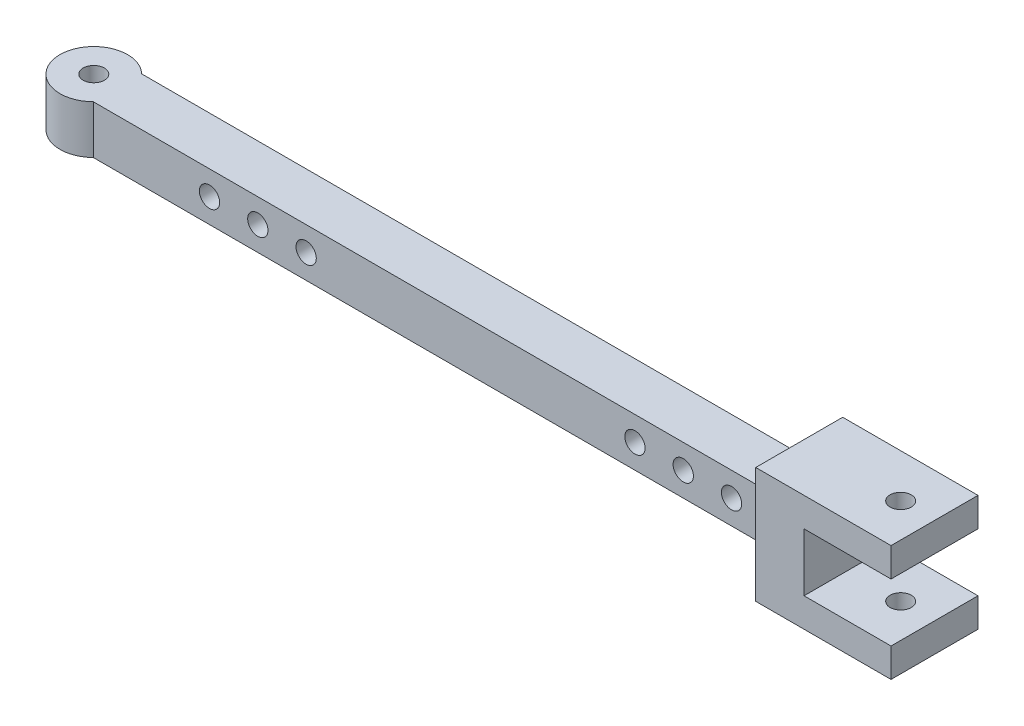
ISO-10303-21;
HEADER;
FILE_DESCRIPTION(('STEP AP214'),'2;1');
FILE_NAME('part.step','',(''),(''),'','','');
FILE_SCHEMA(('AUTOMOTIVE_DESIGN { 1 0 10303 214 1 1 1 1 }'));
ENDSEC;
DATA;
#1=APPLICATION_CONTEXT('core data for automotive mechanical design processes');
#2=APPLICATION_PROTOCOL_DEFINITION('international standard','automotive_design',2000,#1);
#3=PRODUCT_CONTEXT('',#1,'mechanical');
#4=PRODUCT('Part','Part','',(#3));
#5=PRODUCT_RELATED_PRODUCT_CATEGORY('part','',(#4));
#6=PRODUCT_DEFINITION_FORMATION('','',#4);
#7=PRODUCT_DEFINITION_CONTEXT('part definition',#1,'design');
#8=PRODUCT_DEFINITION('design','',#6,#7);
#9=PRODUCT_DEFINITION_SHAPE('','',#8);
#10=(LENGTH_UNIT() NAMED_UNIT(*) SI_UNIT(.MILLI.,.METRE.));
#11=(NAMED_UNIT(*) PLANE_ANGLE_UNIT() SI_UNIT($,.RADIAN.));
#12=(NAMED_UNIT(*) SI_UNIT($,.STERADIAN.) SOLID_ANGLE_UNIT());
#13=UNCERTAINTY_MEASURE_WITH_UNIT(LENGTH_MEASURE(1.E-05),#10,'distance_accuracy_value','');
#14=(GEOMETRIC_REPRESENTATION_CONTEXT(3) GLOBAL_UNCERTAINTY_ASSIGNED_CONTEXT((#13)) GLOBAL_UNIT_ASSIGNED_CONTEXT((#10,
#11,#12)) REPRESENTATION_CONTEXT('',''));
#15=CARTESIAN_POINT('',(0.,0.,0.));
#16=DIRECTION('',(0.,0.,1.));
#17=DIRECTION('',(1.,0.,0.));
#18=AXIS2_PLACEMENT_3D('',#15,#16,#17);
#19=CARTESIAN_POINT('',(47.,-3.5,-4.5));
#20=DIRECTION('',(1.,0.,0.));
#21=DIRECTION('',(0.,0.,-1.));
#22=AXIS2_PLACEMENT_3D('',#19,#20,#21);
#23=PLANE('',#22);
#24=DIRECTION('',(0.,1.,0.));
#25=VECTOR('',#24,1.);
#26=CARTESIAN_POINT('',(47.,-3.5,4.5));
#27=LINE('',#26,#25);
#28=CARTESIAN_POINT('',(47.,5.5,4.5));
#29=VERTEX_POINT('',#28);
#30=CARTESIAN_POINT('',(47.,8.5,4.5));
#31=VERTEX_POINT('',#30);
#32=EDGE_CURVE('E167',#29,#31,#27,.T.);
#33=ORIENTED_EDGE('',*,*,#32,.F.);
#34=DIRECTION('',(0.,0.,-1.));
#35=VECTOR('',#34,1.);
#36=CARTESIAN_POINT('',(47.,5.5,-4.5));
#37=LINE('',#36,#35);
#38=CARTESIAN_POINT('',(47.,5.5,-4.5));
#39=VERTEX_POINT('',#38);
#40=EDGE_CURVE('E208',#29,#39,#37,.T.);
#41=ORIENTED_EDGE('',*,*,#40,.T.);
#42=DIRECTION('',(0.,1.,0.));
#43=VECTOR('',#42,1.);
#44=CARTESIAN_POINT('',(47.,-3.5,-4.5));
#45=LINE('',#44,#43);
#46=CARTESIAN_POINT('',(47.,8.5,-4.5));
#47=VERTEX_POINT('',#46);
#48=EDGE_CURVE('E163',#39,#47,#45,.T.);
#49=ORIENTED_EDGE('',*,*,#48,.T.);
#50=DIRECTION('',(0.,0.,-1.));
#51=VECTOR('',#50,1.);
#52=CARTESIAN_POINT('',(47.,8.5,-4.5));
#53=LINE('',#52,#51);
#54=EDGE_CURVE('E180',#31,#47,#53,.T.);
#55=ORIENTED_EDGE('',*,*,#54,.F.);
#56=EDGE_LOOP('',(#33,#41,#49,#55));
#57=FACE_BOUND('',#56,.T.);
#58=ADVANCED_FACE('F35',(#57),#23,.T.);
#59=DIRECTION('',(0.,0.,-1.));
#60=VECTOR('',#59,1.);
#61=CARTESIAN_POINT('',(47.,-0.5,-4.5));
#62=LINE('',#61,#60);
#63=CARTESIAN_POINT('',(47.,-0.5,4.5));
#64=VERTEX_POINT('',#63);
#65=CARTESIAN_POINT('',(47.,-0.5,-4.5));
#66=VERTEX_POINT('',#65);
#67=EDGE_CURVE('E203',#64,#66,#62,.T.);
#68=ORIENTED_EDGE('',*,*,#67,.F.);
#69=CARTESIAN_POINT('',(47.,-3.5,4.5));
#70=VERTEX_POINT('',#69);
#71=EDGE_CURVE('E158',#70,#64,#27,.T.);
#72=ORIENTED_EDGE('',*,*,#71,.F.);
#73=DIRECTION('',(0.,0.,-1.));
#74=VECTOR('',#73,1.);
#75=CARTESIAN_POINT('',(47.,-3.5,-4.5));
#76=LINE('',#75,#74);
#77=CARTESIAN_POINT('',(47.,-3.5,-4.5));
#78=VERTEX_POINT('',#77);
#79=EDGE_CURVE('E173',#70,#78,#76,.T.);
#80=ORIENTED_EDGE('',*,*,#79,.T.);
#81=EDGE_CURVE('E159',#78,#66,#45,.T.);
#82=ORIENTED_EDGE('',*,*,#81,.T.);
#83=EDGE_LOOP('',(#68,#72,#80,#82));
#84=FACE_BOUND('',#83,.T.);
#85=ADVANCED_FACE('F312',(#84),#23,.T.);
#86=CARTESIAN_POINT('',(33.,-3.5,4.5));
#87=DIRECTION('',(0.,0.,1.));
#88=DIRECTION('',(1.,0.,0.));
#89=AXIS2_PLACEMENT_3D('',#86,#87,#88);
#90=PLANE('',#89);
#91=DIRECTION('',(1.,0.,0.));
#92=VECTOR('',#91,1.);
#93=CARTESIAN_POINT('',(47.,-0.5,4.5));
#94=LINE('',#93,#92);
#95=CARTESIAN_POINT('',(38.,-0.5,4.5));
#96=VERTEX_POINT('',#95);
#97=EDGE_CURVE('E197',#96,#64,#94,.T.);
#98=ORIENTED_EDGE('',*,*,#97,.F.);
#99=DIRECTION('',(0.,1.,0.));
#100=VECTOR('',#99,1.);
#101=CARTESIAN_POINT('',(38.,-0.5,4.5));
#102=LINE('',#101,#100);
#103=CARTESIAN_POINT('',(38.,5.5,4.5));
#104=VERTEX_POINT('',#103);
#105=EDGE_CURVE('E183',#96,#104,#102,.T.);
#106=ORIENTED_EDGE('',*,*,#105,.T.);
#107=DIRECTION('',(1.,0.,0.));
#108=VECTOR('',#107,1.);
#109=CARTESIAN_POINT('',(47.,5.5,4.5));
#110=LINE('',#109,#108);
#111=EDGE_CURVE('E200',#104,#29,#110,.T.);
#112=ORIENTED_EDGE('',*,*,#111,.T.);
#113=ORIENTED_EDGE('',*,*,#32,.T.);
#114=DIRECTION('',(1.,0.,0.));
#115=VECTOR('',#114,1.);
#116=CARTESIAN_POINT('',(33.,8.5,4.5));
#117=LINE('',#116,#115);
#118=CARTESIAN_POINT('',(33.,8.5,4.5));
#119=VERTEX_POINT('',#118);
#120=EDGE_CURVE('E170',#119,#31,#117,.T.);
#121=ORIENTED_EDGE('',*,*,#120,.F.);
#122=DIRECTION('',(0.,1.,0.));
#123=VECTOR('',#122,1.);
#124=CARTESIAN_POINT('',(33.,-3.5,4.5));
#125=LINE('',#124,#123);
#126=CARTESIAN_POINT('',(33.,-3.5,4.5));
#127=VERTEX_POINT('',#126);
#128=EDGE_CURVE('E165',#127,#119,#125,.T.);
#129=ORIENTED_EDGE('',*,*,#128,.F.);
#130=DIRECTION('',(1.,0.,0.));
#131=VECTOR('',#130,1.);
#132=CARTESIAN_POINT('',(33.,-3.5,4.5));
#133=LINE('',#132,#131);
#134=EDGE_CURVE('E184',#127,#70,#133,.T.);
#135=ORIENTED_EDGE('',*,*,#134,.T.);
#136=ORIENTED_EDGE('',*,*,#71,.T.);
#137=EDGE_LOOP('',(#98,#106,#112,#113,#121,#129,#135,#136));
#138=FACE_BOUND('',#137,.T.);
#139=ADVANCED_FACE('F318',(#138),#90,.T.);
#140=CARTESIAN_POINT('',(33.,-3.5,-4.5));
#141=DIRECTION('',(-1.,0.,0.));
#142=DIRECTION('',(0.,0.,1.));
#143=AXIS2_PLACEMENT_3D('',#140,#141,#142);
#144=PLANE('',#143);
#145=DIRECTION('',(0.,-1.,0.));
#146=VECTOR('',#145,1.);
#147=CARTESIAN_POINT('',(33.,5.,-2.5));
#148=LINE('',#147,#146);
#149=CARTESIAN_POINT('',(33.,5.,-2.5));
#150=VERTEX_POINT('',#149);
#151=CARTESIAN_POINT('',(33.,0.,-2.5));
#152=VERTEX_POINT('',#151);
#153=EDGE_CURVE('E153',#150,#152,#148,.T.);
#154=ORIENTED_EDGE('',*,*,#153,.F.);
#155=DIRECTION('',(0.,0.,1.));
#156=VECTOR('',#155,1.);
#157=CARTESIAN_POINT('',(33.,5.,0.));
#158=LINE('',#157,#156);
#159=CARTESIAN_POINT('',(33.,5.,2.5));
#160=VERTEX_POINT('',#159);
#161=EDGE_CURVE('E147',#150,#160,#158,.T.);
#162=ORIENTED_EDGE('',*,*,#161,.T.);
#163=DIRECTION('',(0.,1.,0.));
#164=VECTOR('',#163,1.);
#165=CARTESIAN_POINT('',(33.,5.,2.5));
#166=LINE('',#165,#164);
#167=CARTESIAN_POINT('',(33.,0.,2.5));
#168=VERTEX_POINT('',#167);
#169=EDGE_CURVE('E156',#168,#160,#166,.T.);
#170=ORIENTED_EDGE('',*,*,#169,.F.);
#171=DIRECTION('',(0.,0.,1.));
#172=VECTOR('',#171,1.);
#173=CARTESIAN_POINT('',(33.,0.,0.));
#174=LINE('',#173,#172);
#175=EDGE_CURVE('E11',#152,#168,#174,.T.);
#176=ORIENTED_EDGE('',*,*,#175,.F.);
#177=EDGE_LOOP('',(#154,#162,#170,#176));
#178=FACE_BOUND('',#177,.T.);
#179=DIRECTION('',(0.,0.,1.));
#180=VECTOR('',#179,1.);
#181=CARTESIAN_POINT('',(33.,8.5,-4.5));
#182=LINE('',#181,#180);
#183=CARTESIAN_POINT('',(33.,8.5,-4.5));
#184=VERTEX_POINT('',#183);
#185=EDGE_CURVE('E174',#184,#119,#182,.T.);
#186=ORIENTED_EDGE('',*,*,#185,.F.);
#187=DIRECTION('',(0.,1.,0.));
#188=VECTOR('',#187,1.);
#189=CARTESIAN_POINT('',(33.,-3.5,-4.5));
#190=LINE('',#189,#188);
#191=CARTESIAN_POINT('',(33.,-3.5,-4.5));
#192=VERTEX_POINT('',#191);
#193=EDGE_CURVE('E162',#192,#184,#190,.T.);
#194=ORIENTED_EDGE('',*,*,#193,.F.);
#195=DIRECTION('',(0.,0.,1.));
#196=VECTOR('',#195,1.);
#197=CARTESIAN_POINT('',(33.,-3.5,-4.5));
#198=LINE('',#197,#196);
#199=EDGE_CURVE('E187',#192,#127,#198,.T.);
#200=ORIENTED_EDGE('',*,*,#199,.T.);
#201=ORIENTED_EDGE('',*,*,#128,.T.);
#202=EDGE_LOOP('',(#186,#194,#200,#201));
#203=FACE_BOUND('',#202,.T.);
#204=ADVANCED_FACE('F344',(#178,#203),#144,.T.);
#205=CARTESIAN_POINT('',(33.,-3.5,-4.5));
#206=DIRECTION('',(0.,0.,-1.));
#207=DIRECTION('',(-1.,0.,0.));
#208=AXIS2_PLACEMENT_3D('',#205,#206,#207);
#209=PLANE('',#208);
#210=DIRECTION('',(-1.,0.,0.));
#211=VECTOR('',#210,1.);
#212=CARTESIAN_POINT('',(47.,-0.5,-4.5));
#213=LINE('',#212,#211);
#214=CARTESIAN_POINT('',(38.,-0.5,-4.5));
#215=VERTEX_POINT('',#214);
#216=EDGE_CURVE('E216',#66,#215,#213,.T.);
#217=ORIENTED_EDGE('',*,*,#216,.F.);
#218=ORIENTED_EDGE('',*,*,#81,.F.);
#219=DIRECTION('',(-1.,0.,0.));
#220=VECTOR('',#219,1.);
#221=CARTESIAN_POINT('',(33.,-3.5,-4.5));
#222=LINE('',#221,#220);
#223=EDGE_CURVE('E190',#78,#192,#222,.T.);
#224=ORIENTED_EDGE('',*,*,#223,.T.);
#225=ORIENTED_EDGE('',*,*,#193,.T.);
#226=DIRECTION('',(-1.,0.,0.));
#227=VECTOR('',#226,1.);
#228=CARTESIAN_POINT('',(33.,8.5,-4.5));
#229=LINE('',#228,#227);
#230=EDGE_CURVE('E177',#47,#184,#229,.T.);
#231=ORIENTED_EDGE('',*,*,#230,.F.);
#232=ORIENTED_EDGE('',*,*,#48,.F.);
#233=DIRECTION('',(-1.,0.,0.));
#234=VECTOR('',#233,1.);
#235=CARTESIAN_POINT('',(47.,5.5,-4.5));
#236=LINE('',#235,#234);
#237=CARTESIAN_POINT('',(38.,5.5,-4.5));
#238=VERTEX_POINT('',#237);
#239=EDGE_CURVE('E205',#39,#238,#236,.T.);
#240=ORIENTED_EDGE('',*,*,#239,.T.);
#241=DIRECTION('',(0.,1.,0.));
#242=VECTOR('',#241,1.);
#243=CARTESIAN_POINT('',(38.,-0.5,-4.5));
#244=LINE('',#243,#242);
#245=EDGE_CURVE('E195',#215,#238,#244,.T.);
#246=ORIENTED_EDGE('',*,*,#245,.F.);
#247=EDGE_LOOP('',(#217,#218,#224,#225,#231,#232,#240,#246));
#248=FACE_BOUND('',#247,.T.);
#249=ADVANCED_FACE('F323',(#248),#209,.T.);
#250=CARTESIAN_POINT('',(0.,-3.5,0.));
#251=DIRECTION('',(0.,1.,0.));
#252=DIRECTION('',(0.,0.,1.));
#253=AXIS2_PLACEMENT_3D('',#250,#251,#252);
#254=PLANE('',#253);
#255=CARTESIAN_POINT('',(43.5,-3.5,0.));
#256=DIRECTION('',(0.,1.,0.));
#257=DIRECTION('',(0.,0.,1.));
#258=AXIS2_PLACEMENT_3D('',#255,#256,#257);
#259=CIRCLE('',#258,1.1);
#260=CARTESIAN_POINT('',(43.5,-3.5,1.1));
#261=VERTEX_POINT('',#260);
#262=EDGE_CURVE('E225',#261,#261,#259,.T.);
#263=ORIENTED_EDGE('',*,*,#262,.T.);
#264=EDGE_LOOP('',(#263));
#265=FACE_BOUND('',#264,.T.);
#266=ORIENTED_EDGE('',*,*,#79,.F.);
#267=ORIENTED_EDGE('',*,*,#134,.F.);
#268=ORIENTED_EDGE('',*,*,#199,.F.);
#269=ORIENTED_EDGE('',*,*,#223,.F.);
#270=EDGE_LOOP('',(#266,#267,#268,#269));
#271=FACE_BOUND('',#270,.T.);
#272=ADVANCED_FACE('F360',(#265,#271),#254,.F.);
#273=CARTESIAN_POINT('',(0.,8.5,0.));
#274=DIRECTION('',(0.,1.,0.));
#275=DIRECTION('',(0.,0.,1.));
#276=AXIS2_PLACEMENT_3D('',#273,#274,#275);
#277=PLANE('',#276);
#278=CARTESIAN_POINT('',(43.5,8.5,0.));
#279=DIRECTION('',(0.,1.,0.));
#280=DIRECTION('',(0.,0.,1.));
#281=AXIS2_PLACEMENT_3D('',#278,#279,#280);
#282=CIRCLE('',#281,1.1);
#283=CARTESIAN_POINT('',(43.5,8.5,1.1));
#284=VERTEX_POINT('',#283);
#285=EDGE_CURVE('E222',#284,#284,#282,.T.);
#286=ORIENTED_EDGE('',*,*,#285,.F.);
#287=EDGE_LOOP('',(#286));
#288=FACE_BOUND('',#287,.T.);
#289=ORIENTED_EDGE('',*,*,#54,.T.);
#290=ORIENTED_EDGE('',*,*,#230,.T.);
#291=ORIENTED_EDGE('',*,*,#185,.T.);
#292=ORIENTED_EDGE('',*,*,#120,.T.);
#293=EDGE_LOOP('',(#289,#290,#291,#292));
#294=FACE_BOUND('',#293,.T.);
#295=ADVANCED_FACE('F352',(#288,#294),#277,.T.);
#296=CARTESIAN_POINT('',(-40.,5.,-2.5));
#297=DIRECTION('',(0.,0.,1.));
#298=DIRECTION('',(1.,0.,0.));
#299=AXIS2_PLACEMENT_3D('',#296,#297,#298);
#300=PLANE('',#299);
#301=CARTESIAN_POINT('',(28.5,2.5,-2.5));
#302=DIRECTION('',(0.,0.,1.));
#303=DIRECTION('',(1.,0.,0.));
#304=AXIS2_PLACEMENT_3D('',#301,#302,#303);
#305=CIRCLE('',#304,1.05);
#306=CARTESIAN_POINT('',(29.55,2.5,-2.5));
#307=VERTEX_POINT('',#306);
#308=EDGE_CURVE('E264',#307,#307,#305,.T.);
#309=ORIENTED_EDGE('',*,*,#308,.T.);
#310=EDGE_LOOP('',(#309));
#311=FACE_BOUND('',#310,.T.);
#312=CARTESIAN_POINT('',(18.5,2.5,-2.5));
#313=DIRECTION('',(0.,0.,1.));
#314=DIRECTION('',(1.,0.,0.));
#315=AXIS2_PLACEMENT_3D('',#312,#313,#314);
#316=CIRCLE('',#315,1.05);
#317=CARTESIAN_POINT('',(19.55,2.5,-2.5));
#318=VERTEX_POINT('',#317);
#319=EDGE_CURVE('E258',#318,#318,#316,.T.);
#320=ORIENTED_EDGE('',*,*,#319,.T.);
#321=EDGE_LOOP('',(#320));
#322=FACE_BOUND('',#321,.T.);
#323=CARTESIAN_POINT('',(-15.5252551286084,2.5,-2.5));
#324=DIRECTION('',(0.,0.,1.));
#325=DIRECTION('',(1.,0.,0.));
#326=AXIS2_PLACEMENT_3D('',#323,#324,#325);
#327=CIRCLE('',#326,1.05);
#328=CARTESIAN_POINT('',(-14.4752551286084,2.5,-2.5));
#329=VERTEX_POINT('',#328);
#330=EDGE_CURVE('E252',#329,#329,#327,.T.);
#331=ORIENTED_EDGE('',*,*,#330,.T.);
#332=EDGE_LOOP('',(#331));
#333=FACE_BOUND('',#332,.T.);
#334=CARTESIAN_POINT('',(-25.5252551286084,2.5,-2.5));
#335=DIRECTION('',(0.,0.,1.));
#336=DIRECTION('',(1.,0.,0.));
#337=AXIS2_PLACEMENT_3D('',#334,#335,#336);
#338=CIRCLE('',#337,1.05);
#339=CARTESIAN_POINT('',(-24.4752551286084,2.5,-2.5));
#340=VERTEX_POINT('',#339);
#341=EDGE_CURVE('E246',#340,#340,#338,.T.);
#342=ORIENTED_EDGE('',*,*,#341,.T.);
#343=EDGE_LOOP('',(#342));
#344=FACE_BOUND('',#343,.T.);
#345=CARTESIAN_POINT('',(23.5,2.5,-2.5));
#346=DIRECTION('',(0.,0.,1.));
#347=DIRECTION('',(1.,0.,0.));
#348=AXIS2_PLACEMENT_3D('',#345,#346,#347);
#349=CIRCLE('',#348,1.05);
#350=CARTESIAN_POINT('',(24.55,2.5,-2.5));
#351=VERTEX_POINT('',#350);
#352=EDGE_CURVE('E240',#351,#351,#349,.T.);
#353=ORIENTED_EDGE('',*,*,#352,.T.);
#354=EDGE_LOOP('',(#353));
#355=FACE_BOUND('',#354,.T.);
#356=CARTESIAN_POINT('',(-20.5252551286084,2.5,-2.5));
#357=DIRECTION('',(0.,0.,1.));
#358=DIRECTION('',(1.,0.,0.));
#359=AXIS2_PLACEMENT_3D('',#356,#357,#358);
#360=CIRCLE('',#359,1.05);
#361=CARTESIAN_POINT('',(-19.4752551286084,2.5,-2.5));
#362=VERTEX_POINT('',#361);
#363=EDGE_CURVE('E234',#362,#362,#360,.T.);
#364=ORIENTED_EDGE('',*,*,#363,.T.);
#365=EDGE_LOOP('',(#364));
#366=FACE_BOUND('',#365,.T.);
#367=DIRECTION('',(-1.,0.,0.));
#368=VECTOR('',#367,1.);
#369=CARTESIAN_POINT('',(-40.,0.,-2.5));
#370=LINE('',#369,#368);
#371=CARTESIAN_POINT('',(-37.5505102572168,0.,-2.5));
#372=VERTEX_POINT('',#371);
#373=EDGE_CURVE('E144',#152,#372,#370,.T.);
#374=ORIENTED_EDGE('',*,*,#373,.T.);
#375=DIRECTION('',(0.,1.,0.));
#376=VECTOR('',#375,1.);
#377=CARTESIAN_POINT('',(-37.5505102572168,0.,-2.5));
#378=LINE('',#377,#376);
#379=CARTESIAN_POINT('',(-37.5505102572168,5.,-2.5));
#380=VERTEX_POINT('',#379);
#381=EDGE_CURVE('E130',#372,#380,#378,.T.);
#382=ORIENTED_EDGE('',*,*,#381,.T.);
#383=DIRECTION('',(-1.,0.,0.));
#384=VECTOR('',#383,1.);
#385=CARTESIAN_POINT('',(-40.,5.,-2.5));
#386=LINE('',#385,#384);
#387=EDGE_CURVE('E143',#150,#380,#386,.T.);
#388=ORIENTED_EDGE('',*,*,#387,.F.);
#389=ORIENTED_EDGE('',*,*,#153,.T.);
#390=EDGE_LOOP('',(#374,#382,#388,#389));
#391=FACE_BOUND('',#390,.T.);
#392=ADVANCED_FACE('F37',(#311,#322,#333,#344,#355,#366,#391),#300,.F.);
#393=CARTESIAN_POINT('',(-40.,5.,2.5));
#394=DIRECTION('',(0.,0.,-1.));
#395=DIRECTION('',(-1.,0.,0.));
#396=AXIS2_PLACEMENT_3D('',#393,#394,#395);
#397=PLANE('',#396);
#398=CARTESIAN_POINT('',(28.5,2.5,2.5));
#399=DIRECTION('',(0.,0.,1.));
#400=DIRECTION('',(1.,0.,0.));
#401=AXIS2_PLACEMENT_3D('',#398,#399,#400);
#402=CIRCLE('',#401,1.05);
#403=CARTESIAN_POINT('',(29.55,2.5,2.5));
#404=VERTEX_POINT('',#403);
#405=EDGE_CURVE('E267',#404,#404,#402,.T.);
#406=ORIENTED_EDGE('',*,*,#405,.F.);
#407=EDGE_LOOP('',(#406));
#408=FACE_BOUND('',#407,.T.);
#409=CARTESIAN_POINT('',(18.5,2.5,2.5));
#410=DIRECTION('',(0.,0.,1.));
#411=DIRECTION('',(1.,0.,0.));
#412=AXIS2_PLACEMENT_3D('',#409,#410,#411);
#413=CIRCLE('',#412,1.05);
#414=CARTESIAN_POINT('',(19.55,2.5,2.5));
#415=VERTEX_POINT('',#414);
#416=EDGE_CURVE('E261',#415,#415,#413,.T.);
#417=ORIENTED_EDGE('',*,*,#416,.F.);
#418=EDGE_LOOP('',(#417));
#419=FACE_BOUND('',#418,.T.);
#420=CARTESIAN_POINT('',(-15.5252551286084,2.5,2.5));
#421=DIRECTION('',(0.,0.,1.));
#422=DIRECTION('',(1.,0.,0.));
#423=AXIS2_PLACEMENT_3D('',#420,#421,#422);
#424=CIRCLE('',#423,1.05);
#425=CARTESIAN_POINT('',(-14.4752551286084,2.5,2.5));
#426=VERTEX_POINT('',#425);
#427=EDGE_CURVE('E255',#426,#426,#424,.T.);
#428=ORIENTED_EDGE('',*,*,#427,.F.);
#429=EDGE_LOOP('',(#428));
#430=FACE_BOUND('',#429,.T.);
#431=CARTESIAN_POINT('',(-25.5252551286084,2.5,2.5));
#432=DIRECTION('',(0.,0.,1.));
#433=DIRECTION('',(1.,0.,0.));
#434=AXIS2_PLACEMENT_3D('',#431,#432,#433);
#435=CIRCLE('',#434,1.05);
#436=CARTESIAN_POINT('',(-24.4752551286084,2.5,2.5));
#437=VERTEX_POINT('',#436);
#438=EDGE_CURVE('E249',#437,#437,#435,.T.);
#439=ORIENTED_EDGE('',*,*,#438,.F.);
#440=EDGE_LOOP('',(#439));
#441=FACE_BOUND('',#440,.T.);
#442=CARTESIAN_POINT('',(23.5,2.5,2.5));
#443=DIRECTION('',(0.,0.,1.));
#444=DIRECTION('',(1.,0.,0.));
#445=AXIS2_PLACEMENT_3D('',#442,#443,#444);
#446=CIRCLE('',#445,1.05);
#447=CARTESIAN_POINT('',(24.55,2.5,2.5));
#448=VERTEX_POINT('',#447);
#449=EDGE_CURVE('E243',#448,#448,#446,.T.);
#450=ORIENTED_EDGE('',*,*,#449,.F.);
#451=EDGE_LOOP('',(#450));
#452=FACE_BOUND('',#451,.T.);
#453=CARTESIAN_POINT('',(-20.5252551286084,2.5,2.5));
#454=DIRECTION('',(0.,0.,1.));
#455=DIRECTION('',(1.,0.,0.));
#456=AXIS2_PLACEMENT_3D('',#453,#454,#455);
#457=CIRCLE('',#456,1.05);
#458=CARTESIAN_POINT('',(-19.4752551286084,2.5,2.5));
#459=VERTEX_POINT('',#458);
#460=EDGE_CURVE('E237',#459,#459,#457,.T.);
#461=ORIENTED_EDGE('',*,*,#460,.F.);
#462=EDGE_LOOP('',(#461));
#463=FACE_BOUND('',#462,.T.);
#464=DIRECTION('',(1.,0.,0.));
#465=VECTOR('',#464,1.);
#466=CARTESIAN_POINT('',(-40.,5.,2.5));
#467=LINE('',#466,#465);
#468=CARTESIAN_POINT('',(-37.5505102572168,5.,2.5));
#469=VERTEX_POINT('',#468);
#470=EDGE_CURVE('E44',#469,#160,#467,.T.);
#471=ORIENTED_EDGE('',*,*,#470,.F.);
#472=DIRECTION('',(0.,1.,0.));
#473=VECTOR('',#472,1.);
#474=CARTESIAN_POINT('',(-37.5505102572168,0.,2.5));
#475=LINE('',#474,#473);
#476=CARTESIAN_POINT('',(-37.5505102572168,0.,2.5));
#477=VERTEX_POINT('',#476);
#478=EDGE_CURVE('E127',#469,#477,#475,.F.);
#479=ORIENTED_EDGE('',*,*,#478,.T.);
#480=DIRECTION('',(1.,0.,0.));
#481=VECTOR('',#480,1.);
#482=CARTESIAN_POINT('',(-40.,0.,2.5));
#483=LINE('',#482,#481);
#484=EDGE_CURVE('E139',#477,#168,#483,.T.);
#485=ORIENTED_EDGE('',*,*,#484,.T.);
#486=ORIENTED_EDGE('',*,*,#169,.T.);
#487=EDGE_LOOP('',(#471,#479,#485,#486));
#488=FACE_BOUND('',#487,.T.);
#489=ADVANCED_FACE('F137',(#408,#419,#430,#441,#452,#463,#488),#397,.F.);
#490=CARTESIAN_POINT('',(0.,5.,0.));
#491=DIRECTION('',(0.,1.,0.));
#492=DIRECTION('',(0.,0.,1.));
#493=AXIS2_PLACEMENT_3D('',#490,#491,#492);
#494=PLANE('',#493);
#495=CARTESIAN_POINT('',(-40.,5.,0.));
#496=DIRECTION('',(0.,1.,0.));
#497=DIRECTION('',(0.,0.,1.));
#498=AXIS2_PLACEMENT_3D('',#495,#496,#497);
#499=CIRCLE('',#498,1.1);
#500=CARTESIAN_POINT('',(-40.,5.,1.1));
#501=VERTEX_POINT('',#500);
#502=EDGE_CURVE('E231',#501,#501,#499,.T.);
#503=ORIENTED_EDGE('',*,*,#502,.F.);
#504=EDGE_LOOP('',(#503));
#505=FACE_BOUND('',#504,.T.);
#506=ORIENTED_EDGE('',*,*,#387,.T.);
#507=CARTESIAN_POINT('',(-40.,5.,0.));
#508=DIRECTION('',(0.,1.,0.));
#509=DIRECTION('',(0.,0.,1.));
#510=AXIS2_PLACEMENT_3D('',#507,#508,#509);
#511=CIRCLE('',#510,3.5);
#512=EDGE_CURVE('E51',#380,#469,#511,.T.);
#513=ORIENTED_EDGE('',*,*,#512,.T.);
#514=ORIENTED_EDGE('',*,*,#470,.T.);
#515=ORIENTED_EDGE('',*,*,#161,.F.);
#516=EDGE_LOOP('',(#506,#513,#514,#515));
#517=FACE_BOUND('',#516,.T.);
#518=ADVANCED_FACE('F284',(#505,#517),#494,.T.);
#519=CARTESIAN_POINT('',(0.,0.,0.));
#520=DIRECTION('',(0.,1.,0.));
#521=DIRECTION('',(0.,0.,1.));
#522=AXIS2_PLACEMENT_3D('',#519,#520,#521);
#523=PLANE('',#522);
#524=CARTESIAN_POINT('',(-40.,0.,0.));
#525=DIRECTION('',(0.,1.,0.));
#526=DIRECTION('',(0.,0.,1.));
#527=AXIS2_PLACEMENT_3D('',#524,#525,#526);
#528=CIRCLE('',#527,1.1);
#529=CARTESIAN_POINT('',(-40.,0.,1.1));
#530=VERTEX_POINT('',#529);
#531=EDGE_CURVE('E229',#530,#530,#528,.T.);
#532=ORIENTED_EDGE('',*,*,#531,.T.);
#533=EDGE_LOOP('',(#532));
#534=FACE_BOUND('',#533,.T.);
#535=ORIENTED_EDGE('',*,*,#484,.F.);
#536=CARTESIAN_POINT('',(-40.,0.,0.));
#537=DIRECTION('',(0.,1.,0.));
#538=DIRECTION('',(0.,0.,1.));
#539=AXIS2_PLACEMENT_3D('',#536,#537,#538);
#540=CIRCLE('',#539,3.5);
#541=EDGE_CURVE('E124',#372,#477,#540,.T.);
#542=ORIENTED_EDGE('',*,*,#541,.F.);
#543=ORIENTED_EDGE('',*,*,#373,.F.);
#544=ORIENTED_EDGE('',*,*,#175,.T.);
#545=EDGE_LOOP('',(#535,#542,#543,#544));
#546=FACE_BOUND('',#545,.T.);
#547=ADVANCED_FACE('F142',(#534,#546),#523,.F.);
#548=CARTESIAN_POINT('',(38.,-0.5,-4.5));
#549=DIRECTION('',(-1.,0.,0.));
#550=DIRECTION('',(0.,0.,1.));
#551=AXIS2_PLACEMENT_3D('',#548,#549,#550);
#552=PLANE('',#551);
#553=DIRECTION('',(0.,0.,1.));
#554=VECTOR('',#553,1.);
#555=CARTESIAN_POINT('',(38.,5.5,-4.5));
#556=LINE('',#555,#554);
#557=EDGE_CURVE('E59',#238,#104,#556,.T.);
#558=ORIENTED_EDGE('',*,*,#557,.T.);
#559=ORIENTED_EDGE('',*,*,#105,.F.);
#560=DIRECTION('',(0.,0.,1.));
#561=VECTOR('',#560,1.);
#562=CARTESIAN_POINT('',(38.,-0.5,-4.5));
#563=LINE('',#562,#561);
#564=EDGE_CURVE('E213',#215,#96,#563,.T.);
#565=ORIENTED_EDGE('',*,*,#564,.F.);
#566=ORIENTED_EDGE('',*,*,#245,.T.);
#567=EDGE_LOOP('',(#558,#559,#565,#566));
#568=FACE_BOUND('',#567,.T.);
#569=ADVANCED_FACE('F329',(#568),#552,.F.);
#570=CARTESIAN_POINT('',(0.,-0.5,0.));
#571=DIRECTION('',(0.,-1.,0.));
#572=DIRECTION('',(0.,0.,-1.));
#573=AXIS2_PLACEMENT_3D('',#570,#571,#572);
#574=PLANE('',#573);
#575=CARTESIAN_POINT('',(43.5,-0.5,0.));
#576=DIRECTION('',(0.,-1.,0.));
#577=DIRECTION('',(0.,0.,-1.));
#578=AXIS2_PLACEMENT_3D('',#575,#576,#577);
#579=CIRCLE('',#578,1.1);
#580=CARTESIAN_POINT('',(43.5,-0.5,-1.1));
#581=VERTEX_POINT('',#580);
#582=EDGE_CURVE('E211',#581,#581,#579,.T.);
#583=ORIENTED_EDGE('',*,*,#582,.T.);
#584=EDGE_LOOP('',(#583));
#585=FACE_BOUND('',#584,.T.);
#586=ORIENTED_EDGE('',*,*,#67,.T.);
#587=ORIENTED_EDGE('',*,*,#216,.T.);
#588=ORIENTED_EDGE('',*,*,#564,.T.);
#589=ORIENTED_EDGE('',*,*,#97,.T.);
#590=EDGE_LOOP('',(#586,#587,#588,#589));
#591=FACE_BOUND('',#590,.T.);
#592=ADVANCED_FACE('F334',(#585,#591),#574,.F.);
#593=CARTESIAN_POINT('',(0.,5.5,0.));
#594=DIRECTION('',(0.,-1.,0.));
#595=DIRECTION('',(0.,0.,-1.));
#596=AXIS2_PLACEMENT_3D('',#593,#594,#595);
#597=PLANE('',#596);
#598=CARTESIAN_POINT('',(43.5,5.5,0.));
#599=DIRECTION('',(0.,-1.,0.));
#600=DIRECTION('',(0.,0.,-1.));
#601=AXIS2_PLACEMENT_3D('',#598,#599,#600);
#602=CIRCLE('',#601,1.1);
#603=CARTESIAN_POINT('',(43.5,5.5,-1.1));
#604=VERTEX_POINT('',#603);
#605=EDGE_CURVE('E39',#604,#604,#602,.T.);
#606=ORIENTED_EDGE('',*,*,#605,.F.);
#607=EDGE_LOOP('',(#606));
#608=FACE_BOUND('',#607,.T.);
#609=ORIENTED_EDGE('',*,*,#40,.F.);
#610=ORIENTED_EDGE('',*,*,#111,.F.);
#611=ORIENTED_EDGE('',*,*,#557,.F.);
#612=ORIENTED_EDGE('',*,*,#239,.F.);
#613=EDGE_LOOP('',(#609,#610,#611,#612));
#614=FACE_BOUND('',#613,.T.);
#615=ADVANCED_FACE('F365',(#608,#614),#597,.T.);
#616=CARTESIAN_POINT('',(43.5,-3.5,0.));
#617=DIRECTION('',(0.,1.,0.));
#618=DIRECTION('',(0.,0.,1.));
#619=AXIS2_PLACEMENT_3D('',#616,#617,#618);
#620=CYLINDRICAL_SURFACE('',#619,1.1);
#621=ORIENTED_EDGE('',*,*,#605,.T.);
#622=EDGE_LOOP('',(#621));
#623=FACE_BOUND('',#622,.T.);
#624=ORIENTED_EDGE('',*,*,#285,.T.);
#625=EDGE_LOOP('',(#624));
#626=FACE_BOUND('',#625,.T.);
#627=ADVANCED_FACE('F374',(#623,#626),#620,.F.);
#628=ORIENTED_EDGE('',*,*,#262,.F.);
#629=EDGE_LOOP('',(#628));
#630=FACE_BOUND('',#629,.T.);
#631=ORIENTED_EDGE('',*,*,#582,.F.);
#632=EDGE_LOOP('',(#631));
#633=FACE_BOUND('',#632,.T.);
#634=ADVANCED_FACE('F447',(#630,#633),#620,.F.);
#635=CARTESIAN_POINT('',(-40.,0.,0.));
#636=DIRECTION('',(0.,1.,0.));
#637=DIRECTION('',(0.,0.,1.));
#638=AXIS2_PLACEMENT_3D('',#635,#636,#637);
#639=CYLINDRICAL_SURFACE('',#638,3.5);
#640=ORIENTED_EDGE('',*,*,#381,.F.);
#641=ORIENTED_EDGE('',*,*,#541,.T.);
#642=ORIENTED_EDGE('',*,*,#478,.F.);
#643=ORIENTED_EDGE('',*,*,#512,.F.);
#644=EDGE_LOOP('',(#640,#641,#642,#643));
#645=FACE_BOUND('',#644,.T.);
#646=ADVANCED_FACE('F126',(#645),#639,.T.);
#647=CARTESIAN_POINT('',(-40.,0.,0.));
#648=DIRECTION('',(0.,1.,0.));
#649=DIRECTION('',(0.,0.,1.));
#650=AXIS2_PLACEMENT_3D('',#647,#648,#649);
#651=CYLINDRICAL_SURFACE('',#650,1.1);
#652=ORIENTED_EDGE('',*,*,#531,.F.);
#653=EDGE_LOOP('',(#652));
#654=FACE_BOUND('',#653,.T.);
#655=ORIENTED_EDGE('',*,*,#502,.T.);
#656=EDGE_LOOP('',(#655));
#657=FACE_BOUND('',#656,.T.);
#658=ADVANCED_FACE('F298',(#654,#657),#651,.F.);
#659=CARTESIAN_POINT('',(-20.5252551286084,2.5,-2.5));
#660=DIRECTION('',(0.,0.,1.));
#661=DIRECTION('',(1.,0.,0.));
#662=AXIS2_PLACEMENT_3D('',#659,#660,#661);
#663=CYLINDRICAL_SURFACE('',#662,1.05);
#664=ORIENTED_EDGE('',*,*,#363,.F.);
#665=EDGE_LOOP('',(#664));
#666=FACE_BOUND('',#665,.T.);
#667=ORIENTED_EDGE('',*,*,#460,.T.);
#668=EDGE_LOOP('',(#667));
#669=FACE_BOUND('',#668,.T.);
#670=ADVANCED_FACE('F295',(#666,#669),#663,.F.);
#671=CARTESIAN_POINT('',(23.5,2.5,-2.5));
#672=DIRECTION('',(0.,0.,1.));
#673=DIRECTION('',(1.,0.,0.));
#674=AXIS2_PLACEMENT_3D('',#671,#672,#673);
#675=CYLINDRICAL_SURFACE('',#674,1.05);
#676=ORIENTED_EDGE('',*,*,#352,.F.);
#677=EDGE_LOOP('',(#676));
#678=FACE_BOUND('',#677,.T.);
#679=ORIENTED_EDGE('',*,*,#449,.T.);
#680=EDGE_LOOP('',(#679));
#681=FACE_BOUND('',#680,.T.);
#682=ADVANCED_FACE('F297',(#678,#681),#675,.F.);
#683=CARTESIAN_POINT('',(-25.5252551286084,2.5,-2.5));
#684=DIRECTION('',(0.,0.,1.));
#685=DIRECTION('',(1.,0.,0.));
#686=AXIS2_PLACEMENT_3D('',#683,#684,#685);
#687=CYLINDRICAL_SURFACE('',#686,1.05);
#688=ORIENTED_EDGE('',*,*,#341,.F.);
#689=EDGE_LOOP('',(#688));
#690=FACE_BOUND('',#689,.T.);
#691=ORIENTED_EDGE('',*,*,#438,.T.);
#692=EDGE_LOOP('',(#691));
#693=FACE_BOUND('',#692,.T.);
#694=ADVANCED_FACE('F305',(#690,#693),#687,.F.);
#695=CARTESIAN_POINT('',(-15.5252551286084,2.5,-2.5));
#696=DIRECTION('',(0.,0.,1.));
#697=DIRECTION('',(1.,0.,0.));
#698=AXIS2_PLACEMENT_3D('',#695,#696,#697);
#699=CYLINDRICAL_SURFACE('',#698,1.05);
#700=ORIENTED_EDGE('',*,*,#330,.F.);
#701=EDGE_LOOP('',(#700));
#702=FACE_BOUND('',#701,.T.);
#703=ORIENTED_EDGE('',*,*,#427,.T.);
#704=EDGE_LOOP('',(#703));
#705=FACE_BOUND('',#704,.T.);
#706=ADVANCED_FACE('F525',(#702,#705),#699,.F.);
#707=CARTESIAN_POINT('',(18.5,2.5,-2.5));
#708=DIRECTION('',(0.,0.,1.));
#709=DIRECTION('',(1.,0.,0.));
#710=AXIS2_PLACEMENT_3D('',#707,#708,#709);
#711=CYLINDRICAL_SURFACE('',#710,1.05);
#712=ORIENTED_EDGE('',*,*,#319,.F.);
#713=EDGE_LOOP('',(#712));
#714=FACE_BOUND('',#713,.T.);
#715=ORIENTED_EDGE('',*,*,#416,.T.);
#716=EDGE_LOOP('',(#715));
#717=FACE_BOUND('',#716,.T.);
#718=ADVANCED_FACE('F278',(#714,#717),#711,.F.);
#719=CARTESIAN_POINT('',(28.5,2.5,-2.5));
#720=DIRECTION('',(0.,0.,1.));
#721=DIRECTION('',(1.,0.,0.));
#722=AXIS2_PLACEMENT_3D('',#719,#720,#721);
#723=CYLINDRICAL_SURFACE('',#722,1.05);
#724=ORIENTED_EDGE('',*,*,#308,.F.);
#725=EDGE_LOOP('',(#724));
#726=FACE_BOUND('',#725,.T.);
#727=ORIENTED_EDGE('',*,*,#405,.T.);
#728=EDGE_LOOP('',(#727));
#729=FACE_BOUND('',#728,.T.);
#730=ADVANCED_FACE('F275',(#726,#729),#723,.F.);
#731=CLOSED_SHELL('',(#58,#85,#139,#204,#249,#272,#295,#392,#489,#518,#547,#569,#592,#615,#627,
#634,#646,#658,#670,#682,#694,#706,#718,#730));
#732=MANIFOLD_SOLID_BREP('B2',#731);
#733=ADVANCED_BREP_SHAPE_REPRESENTATION('',(#18,#732),#14);
#734=SHAPE_DEFINITION_REPRESENTATION(#9,#733);
ENDSEC;
END-ISO-10303-21;
